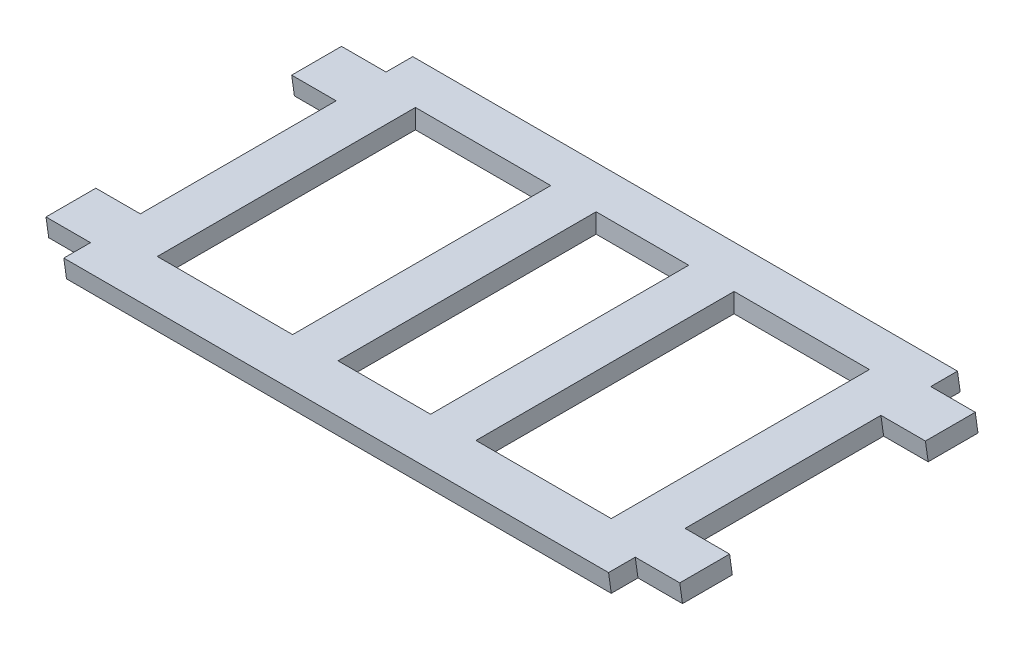
ISO-10303-21;
HEADER;
FILE_DESCRIPTION(('STEP AP214'),'2;1');
FILE_NAME('part.step','',(''),(''),'','','');
FILE_SCHEMA(('AUTOMOTIVE_DESIGN { 1 0 10303 214 1 1 1 1 }'));
ENDSEC;
DATA;
#1=APPLICATION_CONTEXT('core data for automotive mechanical design processes');
#2=APPLICATION_PROTOCOL_DEFINITION('international standard','automotive_design',2000,#1);
#3=PRODUCT_CONTEXT('',#1,'mechanical');
#4=PRODUCT('Part','Part','',(#3));
#5=PRODUCT_RELATED_PRODUCT_CATEGORY('part','',(#4));
#6=PRODUCT_DEFINITION_FORMATION('','',#4);
#7=PRODUCT_DEFINITION_CONTEXT('part definition',#1,'design');
#8=PRODUCT_DEFINITION('design','',#6,#7);
#9=PRODUCT_DEFINITION_SHAPE('','',#8);
#10=(LENGTH_UNIT() NAMED_UNIT(*) SI_UNIT(.MILLI.,.METRE.));
#11=(NAMED_UNIT(*) PLANE_ANGLE_UNIT() SI_UNIT($,.RADIAN.));
#12=(NAMED_UNIT(*) SI_UNIT($,.STERADIAN.) SOLID_ANGLE_UNIT());
#13=UNCERTAINTY_MEASURE_WITH_UNIT(LENGTH_MEASURE(1.E-05),#10,'distance_accuracy_value','');
#14=(GEOMETRIC_REPRESENTATION_CONTEXT(3) GLOBAL_UNCERTAINTY_ASSIGNED_CONTEXT((#13)) GLOBAL_UNIT_ASSIGNED_CONTEXT((#10,
#11,#12)) REPRESENTATION_CONTEXT('',''));
#15=CARTESIAN_POINT('',(0.,0.,0.));
#16=DIRECTION('',(0.,0.,1.));
#17=DIRECTION('',(1.,0.,0.));
#18=AXIS2_PLACEMENT_3D('',#15,#16,#17);
#19=CARTESIAN_POINT('',(0.,2.7667966,0.));
#20=DIRECTION('',(0.,-1.,0.));
#21=DIRECTION('',(0.,0.,-1.));
#22=AXIS2_PLACEMENT_3D('',#19,#20,#21);
#23=PLANE('',#22);
#24=DIRECTION('',(1.,0.,0.));
#25=VECTOR('',#24,1.);
#26=CARTESIAN_POINT('',(77.597,2.7667966,-2.667));
#27=LINE('',#26,#25);
#28=CARTESIAN_POINT('',(58.293,2.7667966,-2.667));
#29=VERTEX_POINT('',#28);
#30=CARTESIAN_POINT('',(77.597,2.7667966,-2.667));
#31=VERTEX_POINT('',#30);
#32=EDGE_CURVE('E324',#29,#31,#27,.T.);
#33=ORIENTED_EDGE('',*,*,#32,.F.);
#34=DIRECTION('',(0.,0.,1.));
#35=VECTOR('',#34,1.);
#36=CARTESIAN_POINT('',(58.293,2.7667966,-2.667));
#37=LINE('',#36,#35);
#38=CARTESIAN_POINT('',(58.293,2.7667966,-39.497));
#39=VERTEX_POINT('',#38);
#40=EDGE_CURVE('E97',#39,#29,#37,.T.);
#41=ORIENTED_EDGE('',*,*,#40,.F.);
#42=DIRECTION('',(-1.,0.,0.));
#43=VECTOR('',#42,1.);
#44=CARTESIAN_POINT('',(77.597,2.7667966,-39.497));
#45=LINE('',#44,#43);
#46=CARTESIAN_POINT('',(77.597,2.7667966,-39.497));
#47=VERTEX_POINT('',#46);
#48=EDGE_CURVE('E330',#47,#39,#45,.T.);
#49=ORIENTED_EDGE('',*,*,#48,.F.);
#50=DIRECTION('',(0.,0.,-1.));
#51=VECTOR('',#50,1.);
#52=CARTESIAN_POINT('',(77.597,2.7667966,-2.667));
#53=LINE('',#52,#51);
#54=EDGE_CURVE('E327',#31,#47,#53,.T.);
#55=ORIENTED_EDGE('',*,*,#54,.F.);
#56=EDGE_LOOP('',(#33,#41,#49,#55));
#57=FACE_BOUND('',#56,.T.);
#58=DIRECTION('',(1.,0.,0.));
#59=VECTOR('',#58,1.);
#60=CARTESIAN_POINT('',(32.131,2.7667966,-2.667));
#61=LINE('',#60,#59);
#62=CARTESIAN_POINT('',(12.827,2.7667966,-2.667));
#63=VERTEX_POINT('',#62);
#64=CARTESIAN_POINT('',(32.131,2.7667966,-2.667));
#65=VERTEX_POINT('',#64);
#66=EDGE_CURVE('E307',#63,#65,#61,.T.);
#67=ORIENTED_EDGE('',*,*,#66,.F.);
#68=DIRECTION('',(0.,0.,1.));
#69=VECTOR('',#68,1.);
#70=CARTESIAN_POINT('',(12.827,2.7667966,-2.667));
#71=LINE('',#70,#69);
#72=CARTESIAN_POINT('',(12.827,2.7667966,-39.497));
#73=VERTEX_POINT('',#72);
#74=EDGE_CURVE('E105',#73,#63,#71,.T.);
#75=ORIENTED_EDGE('',*,*,#74,.F.);
#76=DIRECTION('',(-1.,0.,0.));
#77=VECTOR('',#76,1.);
#78=CARTESIAN_POINT('',(32.131,2.7667966,-39.497));
#79=LINE('',#78,#77);
#80=CARTESIAN_POINT('',(32.131,2.7667966,-39.497));
#81=VERTEX_POINT('',#80);
#82=EDGE_CURVE('E313',#81,#73,#79,.T.);
#83=ORIENTED_EDGE('',*,*,#82,.F.);
#84=DIRECTION('',(0.,0.,-1.));
#85=VECTOR('',#84,1.);
#86=CARTESIAN_POINT('',(32.131,2.7667966,-2.667));
#87=LINE('',#86,#85);
#88=EDGE_CURVE('E297',#65,#81,#87,.T.);
#89=ORIENTED_EDGE('',*,*,#88,.F.);
#90=EDGE_LOOP('',(#67,#75,#83,#89));
#91=FACE_BOUND('',#90,.T.);
#92=DIRECTION('',(1.,0.,0.));
#93=VECTOR('',#92,1.);
#94=CARTESIAN_POINT('',(51.816,2.7667966,-2.66699999999998));
#95=LINE('',#94,#93);
#96=CARTESIAN_POINT('',(38.608,2.7667966,-2.667));
#97=VERTEX_POINT('',#96);
#98=CARTESIAN_POINT('',(51.816,2.7667966,-2.66699999999998));
#99=VERTEX_POINT('',#98);
#100=EDGE_CURVE('E342',#97,#99,#95,.T.);
#101=ORIENTED_EDGE('',*,*,#100,.F.);
#102=DIRECTION('',(0.,0.,1.));
#103=VECTOR('',#102,1.);
#104=CARTESIAN_POINT('',(38.608,2.7667966,-2.667));
#105=LINE('',#104,#103);
#106=CARTESIAN_POINT('',(38.608,2.7667966,-39.497));
#107=VERTEX_POINT('',#106);
#108=EDGE_CURVE('E320',#107,#97,#105,.T.);
#109=ORIENTED_EDGE('',*,*,#108,.F.);
#110=DIRECTION('',(-1.,0.,0.));
#111=VECTOR('',#110,1.);
#112=CARTESIAN_POINT('',(51.816,2.7667966,-39.497));
#113=LINE('',#112,#111);
#114=CARTESIAN_POINT('',(51.816,2.7667966,-39.497));
#115=VERTEX_POINT('',#114);
#116=EDGE_CURVE('E348',#115,#107,#113,.T.);
#117=ORIENTED_EDGE('',*,*,#116,.F.);
#118=DIRECTION('',(0.,0.,-1.));
#119=VECTOR('',#118,1.);
#120=CARTESIAN_POINT('',(51.816,2.7667966,-2.66699999999998));
#121=LINE('',#120,#119);
#122=EDGE_CURVE('E345',#99,#115,#121,.T.);
#123=ORIENTED_EDGE('',*,*,#122,.F.);
#124=EDGE_LOOP('',(#101,#109,#117,#123));
#125=FACE_BOUND('',#124,.T.);
#126=DIRECTION('',(1.,0.,0.));
#127=VECTOR('',#126,1.);
#128=CARTESIAN_POINT('',(0.,2.7667966,0.3888486));
#129=LINE('',#128,#127);
#130=CARTESIAN_POINT('',(0.,2.7667966,0.3888486));
#131=VERTEX_POINT('',#130);
#132=CARTESIAN_POINT('',(6.35,2.7667966,0.3888486));
#133=VERTEX_POINT('',#132);
#134=EDGE_CURVE('E408',#131,#133,#129,.T.);
#135=ORIENTED_EDGE('',*,*,#134,.T.);
#136=DIRECTION('',(0.,0.,1.));
#137=VECTOR('',#136,1.);
#138=CARTESIAN_POINT('',(6.35,2.7667966,0.3888486));
#139=LINE('',#138,#137);
#140=CARTESIAN_POINT('',(6.35,2.7667966,4.1988486));
#141=VERTEX_POINT('',#140);
#142=EDGE_CURVE('E422',#133,#141,#139,.T.);
#143=ORIENTED_EDGE('',*,*,#142,.T.);
#144=DIRECTION('',(1.,0.,0.));
#145=VECTOR('',#144,1.);
#146=CARTESIAN_POINT('',(6.35,2.7667966,4.1988486));
#147=LINE('',#146,#145);
#148=CARTESIAN_POINT('',(84.074,2.7667966,4.1988486));
#149=VERTEX_POINT('',#148);
#150=EDGE_CURVE('E979',#141,#149,#147,.T.);
#151=ORIENTED_EDGE('',*,*,#150,.T.);
#152=DIRECTION('',(0.,0.,-1.));
#153=VECTOR('',#152,1.);
#154=CARTESIAN_POINT('',(84.074,2.7667966,0.3888486));
#155=LINE('',#154,#153);
#156=CARTESIAN_POINT('',(84.074,2.7667966,0.3888486));
#157=VERTEX_POINT('',#156);
#158=EDGE_CURVE('E990',#149,#157,#155,.T.);
#159=ORIENTED_EDGE('',*,*,#158,.T.);
#160=DIRECTION('',(1.,0.,0.));
#161=VECTOR('',#160,1.);
#162=CARTESIAN_POINT('',(90.424,2.7667966,0.3888486));
#163=LINE('',#162,#161);
#164=CARTESIAN_POINT('',(90.424,2.7667966,0.3888486));
#165=VERTEX_POINT('',#164);
#166=EDGE_CURVE('E514',#157,#165,#163,.T.);
#167=ORIENTED_EDGE('',*,*,#166,.T.);
#168=DIRECTION('',(0.,0.,-1.));
#169=VECTOR('',#168,1.);
#170=CARTESIAN_POINT('',(90.424,2.7667966,0.3888486));
#171=LINE('',#170,#169);
#172=CARTESIAN_POINT('',(90.424,2.7667966,-6.7231514));
#173=VERTEX_POINT('',#172);
#174=EDGE_CURVE('E528',#165,#173,#171,.T.);
#175=ORIENTED_EDGE('',*,*,#174,.T.);
#176=DIRECTION('',(-1.,0.,0.));
#177=VECTOR('',#176,1.);
#178=CARTESIAN_POINT('',(90.424,2.7667966,-6.7231514));
#179=LINE('',#178,#177);
#180=CARTESIAN_POINT('',(84.074,2.7667966,-6.7231514));
#181=VERTEX_POINT('',#180);
#182=EDGE_CURVE('E1019',#173,#181,#179,.T.);
#183=ORIENTED_EDGE('',*,*,#182,.T.);
#184=DIRECTION('',(0.,0.,-1.));
#185=VECTOR('',#184,1.);
#186=CARTESIAN_POINT('',(84.074,2.7667966,-6.7231514));
#187=LINE('',#186,#185);
#188=CARTESIAN_POINT('',(84.074,2.7667966,-34.6631514));
#189=VERTEX_POINT('',#188);
#190=EDGE_CURVE('E1032',#181,#189,#187,.T.);
#191=ORIENTED_EDGE('',*,*,#190,.T.);
#192=DIRECTION('',(1.,0.,0.));
#193=VECTOR('',#192,1.);
#194=CARTESIAN_POINT('',(84.074,2.7667966,-34.6631514));
#195=LINE('',#194,#193);
#196=CARTESIAN_POINT('',(90.424,2.7667966,-34.6631514));
#197=VERTEX_POINT('',#196);
#198=EDGE_CURVE('E620',#189,#197,#195,.T.);
#199=ORIENTED_EDGE('',*,*,#198,.T.);
#200=DIRECTION('',(0.,0.,-1.));
#201=VECTOR('',#200,1.);
#202=CARTESIAN_POINT('',(90.424,2.7667966,-34.6631514));
#203=LINE('',#202,#201);
#204=CARTESIAN_POINT('',(90.424,2.7667966,-41.7751514));
#205=VERTEX_POINT('',#204);
#206=EDGE_CURVE('E634',#197,#205,#203,.T.);
#207=ORIENTED_EDGE('',*,*,#206,.T.);
#208=DIRECTION('',(-1.,0.,0.));
#209=VECTOR('',#208,1.);
#210=CARTESIAN_POINT('',(90.424,2.7667966,-41.7751514));
#211=LINE('',#210,#209);
#212=CARTESIAN_POINT('',(84.074,2.7667966,-41.7751514));
#213=VERTEX_POINT('',#212);
#214=EDGE_CURVE('E1559',#205,#213,#211,.T.);
#215=ORIENTED_EDGE('',*,*,#214,.T.);
#216=DIRECTION('',(0.,0.,-1.));
#217=VECTOR('',#216,1.);
#218=CARTESIAN_POINT('',(84.074,2.7667966,-41.7751514));
#219=LINE('',#218,#217);
#220=CARTESIAN_POINT('',(84.074,2.7667966,-45.5851514));
#221=VERTEX_POINT('',#220);
#222=EDGE_CURVE('E1550',#213,#221,#219,.T.);
#223=ORIENTED_EDGE('',*,*,#222,.T.);
#224=DIRECTION('',(-1.,0.,0.));
#225=VECTOR('',#224,1.);
#226=CARTESIAN_POINT('',(6.35,2.7667966,-45.5851514));
#227=LINE('',#226,#225);
#228=CARTESIAN_POINT('',(6.35,2.7667966,-45.5851514));
#229=VERTEX_POINT('',#228);
#230=EDGE_CURVE('E726',#221,#229,#227,.T.);
#231=ORIENTED_EDGE('',*,*,#230,.T.);
#232=DIRECTION('',(0.,0.,1.));
#233=VECTOR('',#232,1.);
#234=CARTESIAN_POINT('',(6.35,2.7667966,-41.7751514));
#235=LINE('',#234,#233);
#236=CARTESIAN_POINT('',(6.35,2.7667966,-41.7751514));
#237=VERTEX_POINT('',#236);
#238=EDGE_CURVE('E740',#229,#237,#235,.T.);
#239=ORIENTED_EDGE('',*,*,#238,.T.);
#240=DIRECTION('',(-1.,0.,0.));
#241=VECTOR('',#240,1.);
#242=CARTESIAN_POINT('',(0.,2.7667966,-41.7751514));
#243=LINE('',#242,#241);
#244=CARTESIAN_POINT('',(0.,2.7667966,-41.7751514));
#245=VERTEX_POINT('',#244);
#246=EDGE_CURVE('E1527',#237,#245,#243,.T.);
#247=ORIENTED_EDGE('',*,*,#246,.T.);
#248=DIRECTION('',(0.,0.,1.));
#249=VECTOR('',#248,1.);
#250=CARTESIAN_POINT('',(0.,2.7667966,-41.7751514));
#251=LINE('',#250,#249);
#252=CARTESIAN_POINT('',(0.,2.7667966,-34.6631514));
#253=VERTEX_POINT('',#252);
#254=EDGE_CURVE('E1518',#245,#253,#251,.T.);
#255=ORIENTED_EDGE('',*,*,#254,.T.);
#256=DIRECTION('',(1.,0.,0.));
#257=VECTOR('',#256,1.);
#258=CARTESIAN_POINT('',(0.,2.7667966,-34.6631514));
#259=LINE('',#258,#257);
#260=CARTESIAN_POINT('',(6.35,2.7667966,-34.6631514));
#261=VERTEX_POINT('',#260);
#262=EDGE_CURVE('E830',#253,#261,#259,.T.);
#263=ORIENTED_EDGE('',*,*,#262,.T.);
#264=DIRECTION('',(0.,0.,1.));
#265=VECTOR('',#264,1.);
#266=CARTESIAN_POINT('',(6.35,2.7667966,-34.6631514));
#267=LINE('',#266,#265);
#268=CARTESIAN_POINT('',(6.35,2.7667966,-6.72315139999998));
#269=VERTEX_POINT('',#268);
#270=EDGE_CURVE('E844',#261,#269,#267,.T.);
#271=ORIENTED_EDGE('',*,*,#270,.T.);
#272=DIRECTION('',(-1.,0.,0.));
#273=VECTOR('',#272,1.);
#274=CARTESIAN_POINT('',(6.35,2.7667966,-6.72315139999998));
#275=LINE('',#274,#273);
#276=CARTESIAN_POINT('',(0.,2.7667966,-6.72315139999998));
#277=VERTEX_POINT('',#276);
#278=EDGE_CURVE('E857',#269,#277,#275,.T.);
#279=ORIENTED_EDGE('',*,*,#278,.T.);
#280=DIRECTION('',(0.,0.,1.));
#281=VECTOR('',#280,1.);
#282=CARTESIAN_POINT('',(0.,2.7667966,-6.72315139999998));
#283=LINE('',#282,#281);
#284=EDGE_CURVE('E966',#277,#131,#283,.T.);
#285=ORIENTED_EDGE('',*,*,#284,.T.);
#286=EDGE_LOOP('',(#135,#143,#151,#159,#167,#175,#183,#191,#199,#207,#215,#223,#231,#239,#247,
#255,#263,#271,#279,#285));
#287=FACE_BOUND('',#286,.T.);
#288=ADVANCED_FACE('F82',(#57,#91,#125,#287),#23,.F.);
#289=CARTESIAN_POINT('',(0.,0.,0.));
#290=DIRECTION('',(0.,-1.,0.));
#291=DIRECTION('',(0.,0.,-1.));
#292=AXIS2_PLACEMENT_3D('',#289,#290,#291);
#293=PLANE('',#292);
#294=DIRECTION('',(0.,0.,-1.));
#295=VECTOR('',#294,1.);
#296=CARTESIAN_POINT('',(58.293,0.,0.));
#297=LINE('',#296,#295);
#298=CARTESIAN_POINT('',(58.293,0.,-2.667));
#299=VERTEX_POINT('',#298);
#300=CARTESIAN_POINT('',(58.293,0.,-39.497));
#301=VERTEX_POINT('',#300);
#302=EDGE_CURVE('E12',#299,#301,#297,.T.);
#303=ORIENTED_EDGE('',*,*,#302,.F.);
#304=DIRECTION('',(-1.,0.,0.));
#305=VECTOR('',#304,1.);
#306=CARTESIAN_POINT('',(0.,0.,-2.66699999999999));
#307=LINE('',#306,#305);
#308=CARTESIAN_POINT('',(77.597,0.,-2.667));
#309=VERTEX_POINT('',#308);
#310=EDGE_CURVE('E937',#309,#299,#307,.T.);
#311=ORIENTED_EDGE('',*,*,#310,.F.);
#312=DIRECTION('',(0.,0.,1.));
#313=VECTOR('',#312,1.);
#314=CARTESIAN_POINT('',(77.597,0.,0.));
#315=LINE('',#314,#313);
#316=CARTESIAN_POINT('',(77.597,0.,-39.497));
#317=VERTEX_POINT('',#316);
#318=EDGE_CURVE('E944',#317,#309,#315,.T.);
#319=ORIENTED_EDGE('',*,*,#318,.F.);
#320=DIRECTION('',(1.,0.,0.));
#321=VECTOR('',#320,1.);
#322=CARTESIAN_POINT('',(0.,0.,-39.497));
#323=LINE('',#322,#321);
#324=EDGE_CURVE('E90',#301,#317,#323,.T.);
#325=ORIENTED_EDGE('',*,*,#324,.F.);
#326=EDGE_LOOP('',(#303,#311,#319,#325));
#327=FACE_BOUND('',#326,.T.);
#328=DIRECTION('',(0.,0.,-1.));
#329=VECTOR('',#328,1.);
#330=CARTESIAN_POINT('',(12.827,0.,0.));
#331=LINE('',#330,#329);
#332=CARTESIAN_POINT('',(12.827,0.,-2.667));
#333=VERTEX_POINT('',#332);
#334=CARTESIAN_POINT('',(12.827,0.,-39.497));
#335=VERTEX_POINT('',#334);
#336=EDGE_CURVE('E950',#333,#335,#331,.T.);
#337=ORIENTED_EDGE('',*,*,#336,.F.);
#338=DIRECTION('',(-1.,0.,0.));
#339=VECTOR('',#338,1.);
#340=CARTESIAN_POINT('',(0.,0.,-2.667));
#341=LINE('',#340,#339);
#342=CARTESIAN_POINT('',(32.131,0.,-2.667));
#343=VERTEX_POINT('',#342);
#344=EDGE_CURVE('E955',#343,#333,#341,.T.);
#345=ORIENTED_EDGE('',*,*,#344,.F.);
#346=DIRECTION('',(0.,0.,1.));
#347=VECTOR('',#346,1.);
#348=CARTESIAN_POINT('',(32.131,0.,0.));
#349=LINE('',#348,#347);
#350=CARTESIAN_POINT('',(32.131,0.,-39.497));
#351=VERTEX_POINT('',#350);
#352=EDGE_CURVE('E300',#351,#343,#349,.T.);
#353=ORIENTED_EDGE('',*,*,#352,.F.);
#354=DIRECTION('',(1.,0.,0.));
#355=VECTOR('',#354,1.);
#356=CARTESIAN_POINT('',(0.,0.,-39.497));
#357=LINE('',#356,#355);
#358=EDGE_CURVE('E952',#335,#351,#357,.T.);
#359=ORIENTED_EDGE('',*,*,#358,.F.);
#360=EDGE_LOOP('',(#337,#345,#353,#359));
#361=FACE_BOUND('',#360,.T.);
#362=DIRECTION('',(0.,0.,-1.));
#363=VECTOR('',#362,1.);
#364=CARTESIAN_POINT('',(38.608,0.,0.));
#365=LINE('',#364,#363);
#366=CARTESIAN_POINT('',(38.608,0.,-2.667));
#367=VERTEX_POINT('',#366);
#368=CARTESIAN_POINT('',(38.608,0.,-39.497));
#369=VERTEX_POINT('',#368);
#370=EDGE_CURVE('E957',#367,#369,#365,.T.);
#371=ORIENTED_EDGE('',*,*,#370,.F.);
#372=DIRECTION('',(-1.,0.,0.));
#373=VECTOR('',#372,1.);
#374=CARTESIAN_POINT('',(0.,0.,-2.66700000000004));
#375=LINE('',#374,#373);
#376=CARTESIAN_POINT('',(51.816,0.,-2.66699999999998));
#377=VERTEX_POINT('',#376);
#378=EDGE_CURVE('E964',#377,#367,#375,.T.);
#379=ORIENTED_EDGE('',*,*,#378,.F.);
#380=DIRECTION('',(0.,0.,1.));
#381=VECTOR('',#380,1.);
#382=CARTESIAN_POINT('',(51.816,0.,0.));
#383=LINE('',#382,#381);
#384=CARTESIAN_POINT('',(51.816,0.,-39.497));
#385=VERTEX_POINT('',#384);
#386=EDGE_CURVE('E961',#385,#377,#383,.T.);
#387=ORIENTED_EDGE('',*,*,#386,.F.);
#388=DIRECTION('',(1.,0.,0.));
#389=VECTOR('',#388,1.);
#390=CARTESIAN_POINT('',(0.,0.,-39.4969999999999));
#391=LINE('',#390,#389);
#392=EDGE_CURVE('E959',#369,#385,#391,.T.);
#393=ORIENTED_EDGE('',*,*,#392,.F.);
#394=EDGE_LOOP('',(#371,#379,#387,#393));
#395=FACE_BOUND('',#394,.T.);
#396=DIRECTION('',(1.,0.,0.));
#397=VECTOR('',#396,1.);
#398=CARTESIAN_POINT('',(0.,0.,0.));
#399=LINE('',#398,#397);
#400=CARTESIAN_POINT('',(0.,0.,0.));
#401=VERTEX_POINT('',#400);
#402=CARTESIAN_POINT('',(6.35,0.,0.));
#403=VERTEX_POINT('',#402);
#404=EDGE_CURVE('E354',#401,#403,#399,.T.);
#405=ORIENTED_EDGE('',*,*,#404,.F.);
#406=DIRECTION('',(0.,0.,1.));
#407=VECTOR('',#406,1.);
#408=CARTESIAN_POINT('',(0.,0.,-7.11200000000001));
#409=LINE('',#408,#407);
#410=CARTESIAN_POINT('',(0.,0.,-7.11200000000001));
#411=VERTEX_POINT('',#410);
#412=EDGE_CURVE('E366',#411,#401,#409,.T.);
#413=ORIENTED_EDGE('',*,*,#412,.F.);
#414=DIRECTION('',(-1.,0.,0.));
#415=VECTOR('',#414,1.);
#416=CARTESIAN_POINT('',(0.,0.,-7.11200000000001));
#417=LINE('',#416,#415);
#418=CARTESIAN_POINT('',(6.35,0.,-7.11200000000001));
#419=VERTEX_POINT('',#418);
#420=EDGE_CURVE('E886',#419,#411,#417,.T.);
#421=ORIENTED_EDGE('',*,*,#420,.F.);
#422=DIRECTION('',(0.,0.,1.));
#423=VECTOR('',#422,1.);
#424=CARTESIAN_POINT('',(6.35,0.,-7.11200000000001));
#425=LINE('',#424,#423);
#426=CARTESIAN_POINT('',(6.35,0.,-35.052));
#427=VERTEX_POINT('',#426);
#428=EDGE_CURVE('E902',#427,#419,#425,.T.);
#429=ORIENTED_EDGE('',*,*,#428,.F.);
#430=DIRECTION('',(1.,0.,0.));
#431=VECTOR('',#430,1.);
#432=CARTESIAN_POINT('',(6.35,0.,-35.052));
#433=LINE('',#432,#431);
#434=CARTESIAN_POINT('',(0.,0.,-35.052));
#435=VERTEX_POINT('',#434);
#436=EDGE_CURVE('E916',#435,#427,#433,.T.);
#437=ORIENTED_EDGE('',*,*,#436,.F.);
#438=DIRECTION('',(0.,0.,1.));
#439=VECTOR('',#438,1.);
#440=CARTESIAN_POINT('',(0.,0.,-35.052));
#441=LINE('',#440,#439);
#442=CARTESIAN_POINT('',(0.,0.,-42.164));
#443=VERTEX_POINT('',#442);
#444=EDGE_CURVE('E799',#443,#435,#441,.T.);
#445=ORIENTED_EDGE('',*,*,#444,.F.);
#446=DIRECTION('',(-1.,0.,0.));
#447=VECTOR('',#446,1.);
#448=CARTESIAN_POINT('',(0.,0.,-42.164));
#449=LINE('',#448,#447);
#450=CARTESIAN_POINT('',(6.35,0.,-42.164));
#451=VERTEX_POINT('',#450);
#452=EDGE_CURVE('E781',#451,#443,#449,.T.);
#453=ORIENTED_EDGE('',*,*,#452,.F.);
#454=DIRECTION('',(0.,0.,1.));
#455=VECTOR('',#454,1.);
#456=CARTESIAN_POINT('',(6.35,0.,-42.164));
#457=LINE('',#456,#455);
#458=CARTESIAN_POINT('',(6.35,0.,-45.974));
#459=VERTEX_POINT('',#458);
#460=EDGE_CURVE('E1113',#459,#451,#457,.T.);
#461=ORIENTED_EDGE('',*,*,#460,.F.);
#462=DIRECTION('',(-1.,0.,0.));
#463=VECTOR('',#462,1.);
#464=CARTESIAN_POINT('',(6.35,0.,-45.974));
#465=LINE('',#464,#463);
#466=CARTESIAN_POINT('',(84.074,0.,-45.974));
#467=VERTEX_POINT('',#466);
#468=EDGE_CURVE('E1104',#467,#459,#465,.T.);
#469=ORIENTED_EDGE('',*,*,#468,.F.);
#470=DIRECTION('',(0.,0.,-1.));
#471=VECTOR('',#470,1.);
#472=CARTESIAN_POINT('',(84.074,0.,-42.164));
#473=LINE('',#472,#471);
#474=CARTESIAN_POINT('',(84.074,0.,-42.164));
#475=VERTEX_POINT('',#474);
#476=EDGE_CURVE('E693',#475,#467,#473,.T.);
#477=ORIENTED_EDGE('',*,*,#476,.F.);
#478=DIRECTION('',(-1.,0.,0.));
#479=VECTOR('',#478,1.);
#480=CARTESIAN_POINT('',(90.424,0.,-42.164));
#481=LINE('',#480,#479);
#482=CARTESIAN_POINT('',(90.424,0.,-42.164));
#483=VERTEX_POINT('',#482);
#484=EDGE_CURVE('E675',#483,#475,#481,.T.);
#485=ORIENTED_EDGE('',*,*,#484,.F.);
#486=DIRECTION('',(0.,0.,-1.));
#487=VECTOR('',#486,1.);
#488=CARTESIAN_POINT('',(90.424,0.,-42.164));
#489=LINE('',#488,#487);
#490=CARTESIAN_POINT('',(90.424,0.,-35.052));
#491=VERTEX_POINT('',#490);
#492=EDGE_CURVE('E1082',#491,#483,#489,.T.);
#493=ORIENTED_EDGE('',*,*,#492,.F.);
#494=DIRECTION('',(1.,0.,0.));
#495=VECTOR('',#494,1.);
#496=CARTESIAN_POINT('',(84.074,0.,-35.052));
#497=LINE('',#496,#495);
#498=CARTESIAN_POINT('',(84.074,0.,-35.052));
#499=VERTEX_POINT('',#498);
#500=EDGE_CURVE('E1073',#499,#491,#497,.T.);
#501=ORIENTED_EDGE('',*,*,#500,.F.);
#502=DIRECTION('',(0.,0.,-1.));
#503=VECTOR('',#502,1.);
#504=CARTESIAN_POINT('',(84.074,0.,-7.112));
#505=LINE('',#504,#503);
#506=CARTESIAN_POINT('',(84.074,0.,-7.112));
#507=VERTEX_POINT('',#506);
#508=EDGE_CURVE('E587',#507,#499,#505,.T.);
#509=ORIENTED_EDGE('',*,*,#508,.F.);
#510=DIRECTION('',(-1.,0.,0.));
#511=VECTOR('',#510,1.);
#512=CARTESIAN_POINT('',(84.074,0.,-7.112));
#513=LINE('',#512,#511);
#514=CARTESIAN_POINT('',(90.424,0.,-7.11199999999999));
#515=VERTEX_POINT('',#514);
#516=EDGE_CURVE('E569',#515,#507,#513,.T.);
#517=ORIENTED_EDGE('',*,*,#516,.F.);
#518=DIRECTION('',(0.,0.,-1.));
#519=VECTOR('',#518,1.);
#520=CARTESIAN_POINT('',(90.424,0.,-7.11199999999999));
#521=LINE('',#520,#519);
#522=CARTESIAN_POINT('',(90.424,0.,0.));
#523=VERTEX_POINT('',#522);
#524=EDGE_CURVE('E1047',#523,#515,#521,.T.);
#525=ORIENTED_EDGE('',*,*,#524,.F.);
#526=DIRECTION('',(1.,0.,0.));
#527=VECTOR('',#526,1.);
#528=CARTESIAN_POINT('',(90.424,0.,0.));
#529=LINE('',#528,#527);
#530=CARTESIAN_POINT('',(84.074,0.,0.));
#531=VERTEX_POINT('',#530);
#532=EDGE_CURVE('E1050',#531,#523,#529,.T.);
#533=ORIENTED_EDGE('',*,*,#532,.F.);
#534=DIRECTION('',(0.,0.,-1.));
#535=VECTOR('',#534,1.);
#536=CARTESIAN_POINT('',(84.074,0.,0.));
#537=LINE('',#536,#535);
#538=CARTESIAN_POINT('',(84.074,0.,3.81));
#539=VERTEX_POINT('',#538);
#540=EDGE_CURVE('E481',#539,#531,#537,.T.);
#541=ORIENTED_EDGE('',*,*,#540,.F.);
#542=DIRECTION('',(1.,0.,0.));
#543=VECTOR('',#542,1.);
#544=CARTESIAN_POINT('',(6.35,0.,3.81));
#545=LINE('',#544,#543);
#546=CARTESIAN_POINT('',(6.35,0.,3.81));
#547=VERTEX_POINT('',#546);
#548=EDGE_CURVE('E463',#547,#539,#545,.T.);
#549=ORIENTED_EDGE('',*,*,#548,.F.);
#550=DIRECTION('',(0.,0.,1.));
#551=VECTOR('',#550,1.);
#552=CARTESIAN_POINT('',(6.35,0.,0.));
#553=LINE('',#552,#551);
#554=EDGE_CURVE('E1164',#403,#547,#553,.T.);
#555=ORIENTED_EDGE('',*,*,#554,.F.);
#556=EDGE_LOOP('',(#405,#413,#421,#429,#437,#445,#453,#461,#469,#477,#485,#493,#501,#509,#517,
#525,#533,#541,#549,#555));
#557=FACE_BOUND('',#556,.T.);
#558=ADVANCED_FACE('F872',(#327,#361,#395,#557),#293,.T.);
#559=CARTESIAN_POINT('',(0.,0.980168124656416,-6.97424610691033));
#560=DIRECTION('',(0.,-0.139173345376293,0.990268034391079));
#561=DIRECTION('',(0.,-0.990268034391079,-0.139173345376293));
#562=AXIS2_PLACEMENT_3D('',#559,#560,#561);
#563=PLANE('',#562);
#564=DIRECTION('',(0.,0.990268034391079,0.139173345376293));
#565=VECTOR('',#564,1.);
#566=CARTESIAN_POINT('',(0.,0.,-7.11200000000001));
#567=LINE('',#566,#565);
#568=EDGE_CURVE('E372',#411,#277,#567,.T.);
#569=ORIENTED_EDGE('',*,*,#568,.T.);
#570=ORIENTED_EDGE('',*,*,#278,.F.);
#571=DIRECTION('',(0.,0.990268034391079,0.139173345376293));
#572=VECTOR('',#571,1.);
#573=CARTESIAN_POINT('',(6.35,0.,-7.11200000000001));
#574=LINE('',#573,#572);
#575=EDGE_CURVE('E889',#419,#269,#574,.T.);
#576=ORIENTED_EDGE('',*,*,#575,.F.);
#577=ORIENTED_EDGE('',*,*,#420,.T.);
#578=EDGE_LOOP('',(#569,#570,#576,#577));
#579=FACE_BOUND('',#578,.T.);
#580=ADVANCED_FACE('F863',(#579),#563,.F.);
#581=CARTESIAN_POINT('',(6.35,0.,0.));
#582=DIRECTION('',(1.,0.,0.));
#583=DIRECTION('',(0.,1.,0.));
#584=AXIS2_PLACEMENT_3D('',#581,#582,#583);
#585=PLANE('',#584);
#586=ORIENTED_EDGE('',*,*,#575,.T.);
#587=ORIENTED_EDGE('',*,*,#270,.F.);
#588=DIRECTION('',(0.,0.990268034391079,0.139173345376291));
#589=VECTOR('',#588,1.);
#590=CARTESIAN_POINT('',(6.35,0.,-35.052));
#591=LINE('',#590,#589);
#592=EDGE_CURVE('E905',#427,#261,#591,.T.);
#593=ORIENTED_EDGE('',*,*,#592,.F.);
#594=ORIENTED_EDGE('',*,*,#428,.T.);
#595=EDGE_LOOP('',(#586,#587,#593,#594));
#596=FACE_BOUND('',#595,.T.);
#597=ADVANCED_FACE('F385',(#596),#585,.F.);
#598=CARTESIAN_POINT('',(0.,0.,0.));
#599=DIRECTION('',(1.,0.,0.));
#600=DIRECTION('',(0.,0.,-1.));
#601=AXIS2_PLACEMENT_3D('',#598,#599,#600);
#602=PLANE('',#601);
#603=DIRECTION('',(0.,0.99026803439108,0.139173345376282));
#604=VECTOR('',#603,1.);
#605=CARTESIAN_POINT('',(0.,0.,0.));
#606=LINE('',#605,#604);
#607=EDGE_CURVE('E891',#401,#131,#606,.T.);
#608=ORIENTED_EDGE('',*,*,#607,.T.);
#609=ORIENTED_EDGE('',*,*,#284,.F.);
#610=ORIENTED_EDGE('',*,*,#568,.F.);
#611=ORIENTED_EDGE('',*,*,#412,.T.);
#612=EDGE_LOOP('',(#608,#609,#610,#611));
#613=FACE_BOUND('',#612,.T.);
#614=ADVANCED_FACE('F374',(#613),#602,.F.);
#615=CARTESIAN_POINT('',(0.,0.,0.));
#616=DIRECTION('',(0.,0.139173345376282,-0.990268034391081));
#617=DIRECTION('',(0.,0.99026803439108,0.139173345376282));
#618=AXIS2_PLACEMENT_3D('',#615,#616,#617);
#619=PLANE('',#618);
#620=DIRECTION('',(0.,0.99026803439108,0.139173345376282));
#621=VECTOR('',#620,1.);
#622=CARTESIAN_POINT('',(6.35,0.,0.));
#623=LINE('',#622,#621);
#624=EDGE_CURVE('E455',#403,#133,#623,.T.);
#625=ORIENTED_EDGE('',*,*,#624,.T.);
#626=ORIENTED_EDGE('',*,*,#134,.F.);
#627=ORIENTED_EDGE('',*,*,#607,.F.);
#628=ORIENTED_EDGE('',*,*,#404,.T.);
#629=EDGE_LOOP('',(#625,#626,#627,#628));
#630=FACE_BOUND('',#629,.T.);
#631=ADVANCED_FACE('F384',(#630),#619,.F.);
#632=CARTESIAN_POINT('',(6.35,0.,0.));
#633=DIRECTION('',(1.,0.,0.));
#634=DIRECTION('',(0.,0.,-1.));
#635=AXIS2_PLACEMENT_3D('',#632,#633,#634);
#636=PLANE('',#635);
#637=DIRECTION('',(0.,0.99026803439108,0.139173345376282));
#638=VECTOR('',#637,1.);
#639=CARTESIAN_POINT('',(6.35,0.,3.81));
#640=LINE('',#639,#638);
#641=EDGE_CURVE('E447',#547,#141,#640,.T.);
#642=ORIENTED_EDGE('',*,*,#641,.T.);
#643=ORIENTED_EDGE('',*,*,#142,.F.);
#644=ORIENTED_EDGE('',*,*,#624,.F.);
#645=ORIENTED_EDGE('',*,*,#554,.T.);
#646=EDGE_LOOP('',(#642,#643,#644,#645));
#647=FACE_BOUND('',#646,.T.);
#648=ADVANCED_FACE('F427',(#647),#636,.F.);
#649=CARTESIAN_POINT('',(0.,-0.52509006678018,3.73620327155911));
#650=DIRECTION('',(0.,0.139173345376282,-0.99026803439108));
#651=DIRECTION('',(0.,0.99026803439108,0.139173345376282));
#652=AXIS2_PLACEMENT_3D('',#649,#650,#651);
#653=PLANE('',#652);
#654=DIRECTION('',(0.,0.99026803439108,0.139173345376282));
#655=VECTOR('',#654,1.);
#656=CARTESIAN_POINT('',(84.074,0.,3.81));
#657=LINE('',#656,#655);
#658=EDGE_CURVE('E454',#539,#149,#657,.T.);
#659=ORIENTED_EDGE('',*,*,#658,.T.);
#660=ORIENTED_EDGE('',*,*,#150,.F.);
#661=ORIENTED_EDGE('',*,*,#641,.F.);
#662=ORIENTED_EDGE('',*,*,#548,.T.);
#663=EDGE_LOOP('',(#659,#660,#661,#662));
#664=FACE_BOUND('',#663,.T.);
#665=ADVANCED_FACE('F436',(#664),#653,.F.);
#666=CARTESIAN_POINT('',(84.074,0.,0.));
#667=DIRECTION('',(-1.,0.,0.));
#668=DIRECTION('',(0.,0.,1.));
#669=AXIS2_PLACEMENT_3D('',#666,#667,#668);
#670=PLANE('',#669);
#671=DIRECTION('',(0.,0.99026803439108,0.139173345376282));
#672=VECTOR('',#671,1.);
#673=CARTESIAN_POINT('',(84.074,0.,0.));
#674=LINE('',#673,#672);
#675=EDGE_CURVE('E474',#531,#157,#674,.T.);
#676=ORIENTED_EDGE('',*,*,#675,.T.);
#677=ORIENTED_EDGE('',*,*,#158,.F.);
#678=ORIENTED_EDGE('',*,*,#658,.F.);
#679=ORIENTED_EDGE('',*,*,#540,.T.);
#680=EDGE_LOOP('',(#676,#677,#678,#679));
#681=FACE_BOUND('',#680,.T.);
#682=ADVANCED_FACE('F487',(#681),#670,.F.);
#683=CARTESIAN_POINT('',(0.,0.,0.));
#684=DIRECTION('',(0.,0.139173345376282,-0.990268034391081));
#685=DIRECTION('',(0.,0.99026803439108,0.139173345376282));
#686=AXIS2_PLACEMENT_3D('',#683,#684,#685);
#687=PLANE('',#686);
#688=DIRECTION('',(0.,0.99026803439108,0.139173345376282));
#689=VECTOR('',#688,1.);
#690=CARTESIAN_POINT('',(90.424,0.,0.));
#691=LINE('',#690,#689);
#692=EDGE_CURVE('E561',#523,#165,#691,.T.);
#693=ORIENTED_EDGE('',*,*,#692,.T.);
#694=ORIENTED_EDGE('',*,*,#166,.F.);
#695=ORIENTED_EDGE('',*,*,#675,.F.);
#696=ORIENTED_EDGE('',*,*,#532,.T.);
#697=EDGE_LOOP('',(#693,#694,#695,#696));
#698=FACE_BOUND('',#697,.T.);
#699=ADVANCED_FACE('F496',(#698),#687,.F.);
#700=CARTESIAN_POINT('',(90.424,0.,0.));
#701=DIRECTION('',(-1.,0.,0.));
#702=DIRECTION('',(0.,0.,1.));
#703=AXIS2_PLACEMENT_3D('',#700,#701,#702);
#704=PLANE('',#703);
#705=DIRECTION('',(0.,0.990268034391081,0.13917334537628));
#706=VECTOR('',#705,1.);
#707=CARTESIAN_POINT('',(90.424,0.,-7.11199999999999));
#708=LINE('',#707,#706);
#709=EDGE_CURVE('E553',#515,#173,#708,.T.);
#710=ORIENTED_EDGE('',*,*,#709,.T.);
#711=ORIENTED_EDGE('',*,*,#174,.F.);
#712=ORIENTED_EDGE('',*,*,#692,.F.);
#713=ORIENTED_EDGE('',*,*,#524,.T.);
#714=EDGE_LOOP('',(#710,#711,#712,#713));
#715=FACE_BOUND('',#714,.T.);
#716=ADVANCED_FACE('F533',(#715),#704,.F.);
#717=CARTESIAN_POINT('',(0.,0.980168124656329,-6.97424610691031));
#718=DIRECTION('',(0.,-0.139173345376281,0.990268034391081));
#719=DIRECTION('',(0.,-0.990268034391081,-0.139173345376281));
#720=AXIS2_PLACEMENT_3D('',#717,#718,#719);
#721=PLANE('',#720);
#722=DIRECTION('',(0.,0.99026803439108,0.139173345376281));
#723=VECTOR('',#722,1.);
#724=CARTESIAN_POINT('',(84.074,0.,-7.112));
#725=LINE('',#724,#723);
#726=EDGE_CURVE('E560',#507,#181,#725,.T.);
#727=ORIENTED_EDGE('',*,*,#726,.T.);
#728=ORIENTED_EDGE('',*,*,#182,.F.);
#729=ORIENTED_EDGE('',*,*,#709,.F.);
#730=ORIENTED_EDGE('',*,*,#516,.T.);
#731=EDGE_LOOP('',(#727,#728,#729,#730));
#732=FACE_BOUND('',#731,.T.);
#733=ADVANCED_FACE('F542',(#732),#721,.F.);
#734=CARTESIAN_POINT('',(84.074,-4.27570015460466E-13,0.));
#735=DIRECTION('',(-1.,0.,0.));
#736=DIRECTION('',(0.,-1.,0.));
#737=AXIS2_PLACEMENT_3D('',#734,#735,#736);
#738=PLANE('',#737);
#739=DIRECTION('',(0.,0.99026803439108,0.139173345376282));
#740=VECTOR('',#739,1.);
#741=CARTESIAN_POINT('',(84.074,0.,-35.052));
#742=LINE('',#741,#740);
#743=EDGE_CURVE('E580',#499,#189,#742,.T.);
#744=ORIENTED_EDGE('',*,*,#743,.T.);
#745=ORIENTED_EDGE('',*,*,#190,.F.);
#746=ORIENTED_EDGE('',*,*,#726,.F.);
#747=ORIENTED_EDGE('',*,*,#508,.T.);
#748=EDGE_LOOP('',(#744,#745,#746,#747));
#749=FACE_BOUND('',#748,.T.);
#750=ADVANCED_FACE('F593',(#749),#738,.F.);
#751=CARTESIAN_POINT('',(0.,4.8308286143779,-34.3730700983438));
#752=DIRECTION('',(0.,0.139173345376289,-0.990268034391079));
#753=DIRECTION('',(0.,0.990268034391079,0.139173345376289));
#754=AXIS2_PLACEMENT_3D('',#751,#752,#753);
#755=PLANE('',#754);
#756=DIRECTION('',(0.,0.99026803439108,0.139173345376289));
#757=VECTOR('',#756,1.);
#758=CARTESIAN_POINT('',(90.424,0.,-35.052));
#759=LINE('',#758,#757);
#760=EDGE_CURVE('E667',#491,#197,#759,.T.);
#761=ORIENTED_EDGE('',*,*,#760,.T.);
#762=ORIENTED_EDGE('',*,*,#198,.F.);
#763=ORIENTED_EDGE('',*,*,#743,.F.);
#764=ORIENTED_EDGE('',*,*,#500,.T.);
#765=EDGE_LOOP('',(#761,#762,#763,#764));
#766=FACE_BOUND('',#765,.T.);
#767=ADVANCED_FACE('F602',(#766),#755,.F.);
#768=CARTESIAN_POINT('',(90.4240000000002,0.,-3.52892318541568E-13));
#769=DIRECTION('',(-1.,0.,0.));
#770=DIRECTION('',(0.,0.,1.));
#771=AXIS2_PLACEMENT_3D('',#768,#769,#770);
#772=PLANE('',#771);
#773=DIRECTION('',(0.,0.99026803439108,0.139173345376289));
#774=VECTOR('',#773,1.);
#775=CARTESIAN_POINT('',(90.424,0.,-42.164));
#776=LINE('',#775,#774);
#777=EDGE_CURVE('E659',#483,#205,#776,.T.);
#778=ORIENTED_EDGE('',*,*,#777,.T.);
#779=ORIENTED_EDGE('',*,*,#206,.F.);
#780=ORIENTED_EDGE('',*,*,#760,.F.);
#781=ORIENTED_EDGE('',*,*,#492,.T.);
#782=EDGE_LOOP('',(#778,#779,#780,#781));
#783=FACE_BOUND('',#782,.T.);
#784=ADVANCED_FACE('F639',(#783),#772,.F.);
#785=CARTESIAN_POINT('',(0.,5.81099673903429,-41.3473162052541));
#786=DIRECTION('',(0.,-0.139173345376289,0.99026803439108));
#787=DIRECTION('',(0.,-0.99026803439108,-0.139173345376289));
#788=AXIS2_PLACEMENT_3D('',#785,#786,#787);
#789=PLANE('',#788);
#790=DIRECTION('',(0.,0.99026803439108,0.139173345376289));
#791=VECTOR('',#790,1.);
#792=CARTESIAN_POINT('',(84.074,0.,-42.164));
#793=LINE('',#792,#791);
#794=EDGE_CURVE('E666',#475,#213,#793,.T.);
#795=ORIENTED_EDGE('',*,*,#794,.T.);
#796=ORIENTED_EDGE('',*,*,#214,.F.);
#797=ORIENTED_EDGE('',*,*,#777,.F.);
#798=ORIENTED_EDGE('',*,*,#484,.T.);
#799=EDGE_LOOP('',(#795,#796,#797,#798));
#800=FACE_BOUND('',#799,.T.);
#801=ADVANCED_FACE('F648',(#800),#789,.F.);
#802=CARTESIAN_POINT('',(84.0740000000002,0.,-3.06236517625773E-13));
#803=DIRECTION('',(-1.,0.,0.));
#804=DIRECTION('',(0.,0.,1.));
#805=AXIS2_PLACEMENT_3D('',#802,#803,#804);
#806=PLANE('',#805);
#807=DIRECTION('',(0.,0.99026803439108,0.139173345376289));
#808=VECTOR('',#807,1.);
#809=CARTESIAN_POINT('',(84.074,0.,-45.974));
#810=LINE('',#809,#808);
#811=EDGE_CURVE('E686',#467,#221,#810,.T.);
#812=ORIENTED_EDGE('',*,*,#811,.T.);
#813=ORIENTED_EDGE('',*,*,#222,.F.);
#814=ORIENTED_EDGE('',*,*,#794,.F.);
#815=ORIENTED_EDGE('',*,*,#476,.T.);
#816=EDGE_LOOP('',(#812,#813,#814,#815));
#817=FACE_BOUND('',#816,.T.);
#818=ADVANCED_FACE('F699',(#817),#806,.F.);
#819=CARTESIAN_POINT('',(0.,6.33608680581438,-45.0835194768132));
#820=DIRECTION('',(0.,-0.139173345376287,0.99026803439108));
#821=DIRECTION('',(0.,-0.99026803439108,-0.139173345376287));
#822=AXIS2_PLACEMENT_3D('',#819,#820,#821);
#823=PLANE('',#822);
#824=DIRECTION('',(0.,0.99026803439108,0.139173345376287));
#825=VECTOR('',#824,1.);
#826=CARTESIAN_POINT('',(6.35,0.,-45.974));
#827=LINE('',#826,#825);
#828=EDGE_CURVE('E773',#459,#229,#827,.T.);
#829=ORIENTED_EDGE('',*,*,#828,.T.);
#830=ORIENTED_EDGE('',*,*,#230,.F.);
#831=ORIENTED_EDGE('',*,*,#811,.F.);
#832=ORIENTED_EDGE('',*,*,#468,.T.);
#833=EDGE_LOOP('',(#829,#830,#831,#832));
#834=FACE_BOUND('',#833,.T.);
#835=ADVANCED_FACE('F708',(#834),#823,.F.);
#836=CARTESIAN_POINT('',(6.35,0.,0.));
#837=DIRECTION('',(1.,0.,0.));
#838=DIRECTION('',(0.,0.,-1.));
#839=AXIS2_PLACEMENT_3D('',#836,#837,#838);
#840=PLANE('',#839);
#841=DIRECTION('',(0.,0.990268034391079,0.139173345376291));
#842=VECTOR('',#841,1.);
#843=CARTESIAN_POINT('',(6.35,0.,-42.164));
#844=LINE('',#843,#842);
#845=EDGE_CURVE('E765',#451,#237,#844,.T.);
#846=ORIENTED_EDGE('',*,*,#845,.T.);
#847=ORIENTED_EDGE('',*,*,#238,.F.);
#848=ORIENTED_EDGE('',*,*,#828,.F.);
#849=ORIENTED_EDGE('',*,*,#460,.T.);
#850=EDGE_LOOP('',(#846,#847,#848,#849));
#851=FACE_BOUND('',#850,.T.);
#852=ADVANCED_FACE('F745',(#851),#840,.F.);
#853=CARTESIAN_POINT('',(0.,5.81099673903439,-41.3473162052541));
#854=DIRECTION('',(0.,-0.139173345376291,0.990268034391079));
#855=DIRECTION('',(0.,-0.990268034391079,-0.139173345376291));
#856=AXIS2_PLACEMENT_3D('',#853,#854,#855);
#857=PLANE('',#856);
#858=DIRECTION('',(0.,0.990268034391079,0.139173345376291));
#859=VECTOR('',#858,1.);
#860=CARTESIAN_POINT('',(0.,0.,-42.164));
#861=LINE('',#860,#859);
#862=EDGE_CURVE('E772',#443,#245,#861,.T.);
#863=ORIENTED_EDGE('',*,*,#862,.T.);
#864=ORIENTED_EDGE('',*,*,#246,.F.);
#865=ORIENTED_EDGE('',*,*,#845,.F.);
#866=ORIENTED_EDGE('',*,*,#452,.T.);
#867=EDGE_LOOP('',(#863,#864,#865,#866));
#868=FACE_BOUND('',#867,.T.);
#869=ADVANCED_FACE('F754',(#868),#857,.F.);
#870=CARTESIAN_POINT('',(0.,0.,0.));
#871=DIRECTION('',(1.,0.,0.));
#872=DIRECTION('',(0.,1.,0.));
#873=AXIS2_PLACEMENT_3D('',#870,#871,#872);
#874=PLANE('',#873);
#875=DIRECTION('',(0.,0.990268034391079,0.139173345376291));
#876=VECTOR('',#875,1.);
#877=CARTESIAN_POINT('',(0.,0.,-35.052));
#878=LINE('',#877,#876);
#879=EDGE_CURVE('E792',#435,#253,#878,.T.);
#880=ORIENTED_EDGE('',*,*,#879,.T.);
#881=ORIENTED_EDGE('',*,*,#254,.F.);
#882=ORIENTED_EDGE('',*,*,#862,.F.);
#883=ORIENTED_EDGE('',*,*,#444,.T.);
#884=EDGE_LOOP('',(#880,#881,#882,#883));
#885=FACE_BOUND('',#884,.T.);
#886=ADVANCED_FACE('F805',(#885),#874,.F.);
#887=CARTESIAN_POINT('',(0.,4.83082861437798,-34.3730700983437));
#888=DIRECTION('',(0.,0.139173345376291,-0.990268034391079));
#889=DIRECTION('',(0.,0.990268034391079,0.139173345376291));
#890=AXIS2_PLACEMENT_3D('',#887,#888,#889);
#891=PLANE('',#890);
#892=ORIENTED_EDGE('',*,*,#592,.T.);
#893=ORIENTED_EDGE('',*,*,#262,.F.);
#894=ORIENTED_EDGE('',*,*,#879,.F.);
#895=ORIENTED_EDGE('',*,*,#436,.T.);
#896=EDGE_LOOP('',(#892,#893,#894,#895));
#897=FACE_BOUND('',#896,.T.);
#898=ADVANCED_FACE('F813',(#897),#891,.F.);
#899=CARTESIAN_POINT('',(38.608,-4.8532034,-2.667));
#900=DIRECTION('',(-1.,0.,0.));
#901=DIRECTION('',(0.,0.,1.));
#902=AXIS2_PLACEMENT_3D('',#899,#900,#901);
#903=PLANE('',#902);
#904=ORIENTED_EDGE('',*,*,#370,.T.);
#905=DIRECTION('',(0.,1.,0.));
#906=VECTOR('',#905,1.);
#907=CARTESIAN_POINT('',(38.608,-4.8532034,-39.497));
#908=LINE('',#907,#906);
#909=EDGE_CURVE('E352',#369,#107,#908,.T.);
#910=ORIENTED_EDGE('',*,*,#909,.T.);
#911=ORIENTED_EDGE('',*,*,#108,.T.);
#912=DIRECTION('',(0.,1.,0.));
#913=VECTOR('',#912,1.);
#914=CARTESIAN_POINT('',(38.608,-4.8532034,-2.667));
#915=LINE('',#914,#913);
#916=EDGE_CURVE('E351',#367,#97,#915,.T.);
#917=ORIENTED_EDGE('',*,*,#916,.F.);
#918=EDGE_LOOP('',(#904,#910,#911,#917));
#919=FACE_BOUND('',#918,.T.);
#920=ADVANCED_FACE('F1269',(#919),#903,.F.);
#921=CARTESIAN_POINT('',(51.816,-4.8532034,-39.497));
#922=DIRECTION('',(0.,0.,-1.));
#923=DIRECTION('',(-1.,0.,0.));
#924=AXIS2_PLACEMENT_3D('',#921,#922,#923);
#925=PLANE('',#924);
#926=ORIENTED_EDGE('',*,*,#392,.T.);
#927=DIRECTION('',(0.,1.,0.));
#928=VECTOR('',#927,1.);
#929=CARTESIAN_POINT('',(51.816,-4.8532034,-39.497));
#930=LINE('',#929,#928);
#931=EDGE_CURVE('E355',#385,#115,#930,.T.);
#932=ORIENTED_EDGE('',*,*,#931,.T.);
#933=ORIENTED_EDGE('',*,*,#116,.T.);
#934=ORIENTED_EDGE('',*,*,#909,.F.);
#935=EDGE_LOOP('',(#926,#932,#933,#934));
#936=FACE_BOUND('',#935,.T.);
#937=ADVANCED_FACE('F1273',(#936),#925,.F.);
#938=CARTESIAN_POINT('',(51.816,-4.8532034,-2.66699999999998));
#939=DIRECTION('',(1.,0.,0.));
#940=DIRECTION('',(0.,0.,-1.));
#941=AXIS2_PLACEMENT_3D('',#938,#939,#940);
#942=PLANE('',#941);
#943=ORIENTED_EDGE('',*,*,#386,.T.);
#944=DIRECTION('',(0.,1.,0.));
#945=VECTOR('',#944,1.);
#946=CARTESIAN_POINT('',(51.816,-4.8532034,-2.66699999999998));
#947=LINE('',#946,#945);
#948=EDGE_CURVE('E357',#377,#99,#947,.T.);
#949=ORIENTED_EDGE('',*,*,#948,.T.);
#950=ORIENTED_EDGE('',*,*,#122,.T.);
#951=ORIENTED_EDGE('',*,*,#931,.F.);
#952=EDGE_LOOP('',(#943,#949,#950,#951));
#953=FACE_BOUND('',#952,.T.);
#954=ADVANCED_FACE('F1281',(#953),#942,.F.);
#955=CARTESIAN_POINT('',(51.816,-4.8532034,-2.66699999999998));
#956=DIRECTION('',(0.,0.,1.));
#957=DIRECTION('',(1.,0.,0.));
#958=AXIS2_PLACEMENT_3D('',#955,#956,#957);
#959=PLANE('',#958);
#960=ORIENTED_EDGE('',*,*,#378,.T.);
#961=ORIENTED_EDGE('',*,*,#916,.T.);
#962=ORIENTED_EDGE('',*,*,#100,.T.);
#963=ORIENTED_EDGE('',*,*,#948,.F.);
#964=EDGE_LOOP('',(#960,#961,#962,#963));
#965=FACE_BOUND('',#964,.T.);
#966=ADVANCED_FACE('F1289',(#965),#959,.F.);
#967=CARTESIAN_POINT('',(12.827,-4.8532034,-2.667));
#968=DIRECTION('',(-1.,0.,0.));
#969=DIRECTION('',(0.,0.,1.));
#970=AXIS2_PLACEMENT_3D('',#967,#968,#969);
#971=PLANE('',#970);
#972=ORIENTED_EDGE('',*,*,#336,.T.);
#973=DIRECTION('',(0.,1.,0.));
#974=VECTOR('',#973,1.);
#975=CARTESIAN_POINT('',(12.827,-4.8532034,-39.497));
#976=LINE('',#975,#974);
#977=EDGE_CURVE('E318',#335,#73,#976,.T.);
#978=ORIENTED_EDGE('',*,*,#977,.T.);
#979=ORIENTED_EDGE('',*,*,#74,.T.);
#980=DIRECTION('',(0.,1.,0.));
#981=VECTOR('',#980,1.);
#982=CARTESIAN_POINT('',(12.827,-4.8532034,-2.667));
#983=LINE('',#982,#981);
#984=EDGE_CURVE('E304',#333,#63,#983,.T.);
#985=ORIENTED_EDGE('',*,*,#984,.F.);
#986=EDGE_LOOP('',(#972,#978,#979,#985));
#987=FACE_BOUND('',#986,.T.);
#988=ADVANCED_FACE('F1297',(#987),#971,.F.);
#989=CARTESIAN_POINT('',(32.131,-4.8532034,-39.497));
#990=DIRECTION('',(0.,0.,-1.));
#991=DIRECTION('',(-1.,0.,0.));
#992=AXIS2_PLACEMENT_3D('',#989,#990,#991);
#993=PLANE('',#992);
#994=ORIENTED_EDGE('',*,*,#358,.T.);
#995=DIRECTION('',(0.,1.,0.));
#996=VECTOR('',#995,1.);
#997=CARTESIAN_POINT('',(32.131,-4.8532034,-39.497));
#998=LINE('',#997,#996);
#999=EDGE_CURVE('E303',#351,#81,#998,.T.);
#1000=ORIENTED_EDGE('',*,*,#999,.T.);
#1001=ORIENTED_EDGE('',*,*,#82,.T.);
#1002=ORIENTED_EDGE('',*,*,#977,.F.);
#1003=EDGE_LOOP('',(#994,#1000,#1001,#1002));
#1004=FACE_BOUND('',#1003,.T.);
#1005=ADVANCED_FACE('F1305',(#1004),#993,.F.);
#1006=CARTESIAN_POINT('',(32.131,-4.8532034,-2.667));
#1007=DIRECTION('',(1.,0.,0.));
#1008=DIRECTION('',(0.,0.,-1.));
#1009=AXIS2_PLACEMENT_3D('',#1006,#1007,#1008);
#1010=PLANE('',#1009);
#1011=ORIENTED_EDGE('',*,*,#352,.T.);
#1012=DIRECTION('',(0.,1.,0.));
#1013=VECTOR('',#1012,1.);
#1014=CARTESIAN_POINT('',(32.131,-4.8532034,-2.667));
#1015=LINE('',#1014,#1013);
#1016=EDGE_CURVE('E292',#343,#65,#1015,.T.);
#1017=ORIENTED_EDGE('',*,*,#1016,.T.);
#1018=ORIENTED_EDGE('',*,*,#88,.T.);
#1019=ORIENTED_EDGE('',*,*,#999,.F.);
#1020=EDGE_LOOP('',(#1011,#1017,#1018,#1019));
#1021=FACE_BOUND('',#1020,.T.);
#1022=ADVANCED_FACE('F294',(#1021),#1010,.F.);
#1023=CARTESIAN_POINT('',(32.131,-4.8532034,-2.667));
#1024=DIRECTION('',(0.,0.,1.));
#1025=DIRECTION('',(1.,0.,0.));
#1026=AXIS2_PLACEMENT_3D('',#1023,#1024,#1025);
#1027=PLANE('',#1026);
#1028=ORIENTED_EDGE('',*,*,#344,.T.);
#1029=ORIENTED_EDGE('',*,*,#984,.T.);
#1030=ORIENTED_EDGE('',*,*,#66,.T.);
#1031=ORIENTED_EDGE('',*,*,#1016,.F.);
#1032=EDGE_LOOP('',(#1028,#1029,#1030,#1031));
#1033=FACE_BOUND('',#1032,.T.);
#1034=ADVANCED_FACE('F308',(#1033),#1027,.F.);
#1035=CARTESIAN_POINT('',(58.293,-4.8532034,-2.667));
#1036=DIRECTION('',(-1.,0.,0.));
#1037=DIRECTION('',(0.,0.,1.));
#1038=AXIS2_PLACEMENT_3D('',#1035,#1036,#1037);
#1039=PLANE('',#1038);
#1040=ORIENTED_EDGE('',*,*,#302,.T.);
#1041=DIRECTION('',(0.,1.,0.));
#1042=VECTOR('',#1041,1.);
#1043=CARTESIAN_POINT('',(58.293,-4.8532034,-39.497));
#1044=LINE('',#1043,#1042);
#1045=EDGE_CURVE('E334',#301,#39,#1044,.T.);
#1046=ORIENTED_EDGE('',*,*,#1045,.T.);
#1047=ORIENTED_EDGE('',*,*,#40,.T.);
#1048=DIRECTION('',(0.,1.,0.));
#1049=VECTOR('',#1048,1.);
#1050=CARTESIAN_POINT('',(58.293,-4.8532034,-2.667));
#1051=LINE('',#1050,#1049);
#1052=EDGE_CURVE('E333',#299,#29,#1051,.T.);
#1053=ORIENTED_EDGE('',*,*,#1052,.F.);
#1054=EDGE_LOOP('',(#1040,#1046,#1047,#1053));
#1055=FACE_BOUND('',#1054,.T.);
#1056=ADVANCED_FACE('F939',(#1055),#1039,.F.);
#1057=CARTESIAN_POINT('',(77.597,-4.8532034,-39.497));
#1058=DIRECTION('',(0.,0.,-1.));
#1059=DIRECTION('',(-1.,0.,0.));
#1060=AXIS2_PLACEMENT_3D('',#1057,#1058,#1059);
#1061=PLANE('',#1060);
#1062=ORIENTED_EDGE('',*,*,#324,.T.);
#1063=DIRECTION('',(0.,1.,0.));
#1064=VECTOR('',#1063,1.);
#1065=CARTESIAN_POINT('',(77.597,-4.8532034,-39.497));
#1066=LINE('',#1065,#1064);
#1067=EDGE_CURVE('E336',#317,#47,#1066,.T.);
#1068=ORIENTED_EDGE('',*,*,#1067,.T.);
#1069=ORIENTED_EDGE('',*,*,#48,.T.);
#1070=ORIENTED_EDGE('',*,*,#1045,.F.);
#1071=EDGE_LOOP('',(#1062,#1068,#1069,#1070));
#1072=FACE_BOUND('',#1071,.T.);
#1073=ADVANCED_FACE('F1331',(#1072),#1061,.F.);
#1074=CARTESIAN_POINT('',(77.597,-4.8532034,-2.667));
#1075=DIRECTION('',(1.,0.,0.));
#1076=DIRECTION('',(0.,0.,-1.));
#1077=AXIS2_PLACEMENT_3D('',#1074,#1075,#1076);
#1078=PLANE('',#1077);
#1079=ORIENTED_EDGE('',*,*,#318,.T.);
#1080=DIRECTION('',(0.,1.,0.));
#1081=VECTOR('',#1080,1.);
#1082=CARTESIAN_POINT('',(77.597,-4.8532034,-2.667));
#1083=LINE('',#1082,#1081);
#1084=EDGE_CURVE('E338',#309,#31,#1083,.T.);
#1085=ORIENTED_EDGE('',*,*,#1084,.T.);
#1086=ORIENTED_EDGE('',*,*,#54,.T.);
#1087=ORIENTED_EDGE('',*,*,#1067,.F.);
#1088=EDGE_LOOP('',(#1079,#1085,#1086,#1087));
#1089=FACE_BOUND('',#1088,.T.);
#1090=ADVANCED_FACE('F1338',(#1089),#1078,.F.);
#1091=CARTESIAN_POINT('',(77.597,-4.8532034,-2.667));
#1092=DIRECTION('',(0.,0.,1.));
#1093=DIRECTION('',(1.,0.,0.));
#1094=AXIS2_PLACEMENT_3D('',#1091,#1092,#1093);
#1095=PLANE('',#1094);
#1096=ORIENTED_EDGE('',*,*,#310,.T.);
#1097=ORIENTED_EDGE('',*,*,#1052,.T.);
#1098=ORIENTED_EDGE('',*,*,#32,.T.);
#1099=ORIENTED_EDGE('',*,*,#1084,.F.);
#1100=EDGE_LOOP('',(#1096,#1097,#1098,#1099));
#1101=FACE_BOUND('',#1100,.T.);
#1102=ADVANCED_FACE('F934',(#1101),#1095,.F.);
#1103=CLOSED_SHELL('',(#288,#558,#580,#597,#614,#631,#648,#665,#682,#699,#716,#733,#750,#767,
#784,#801,#818,#835,#852,#869,#886,#898,#920,#937,#954,#966,#988,#1005,#1022,#1034,#1056,#1073,
#1090,#1102));
#1104=MANIFOLD_SOLID_BREP('B2',#1103);
#1105=ADVANCED_BREP_SHAPE_REPRESENTATION('',(#18,#1104),#14);
#1106=SHAPE_DEFINITION_REPRESENTATION(#9,#1105);
ENDSEC;
END-ISO-10303-21;
